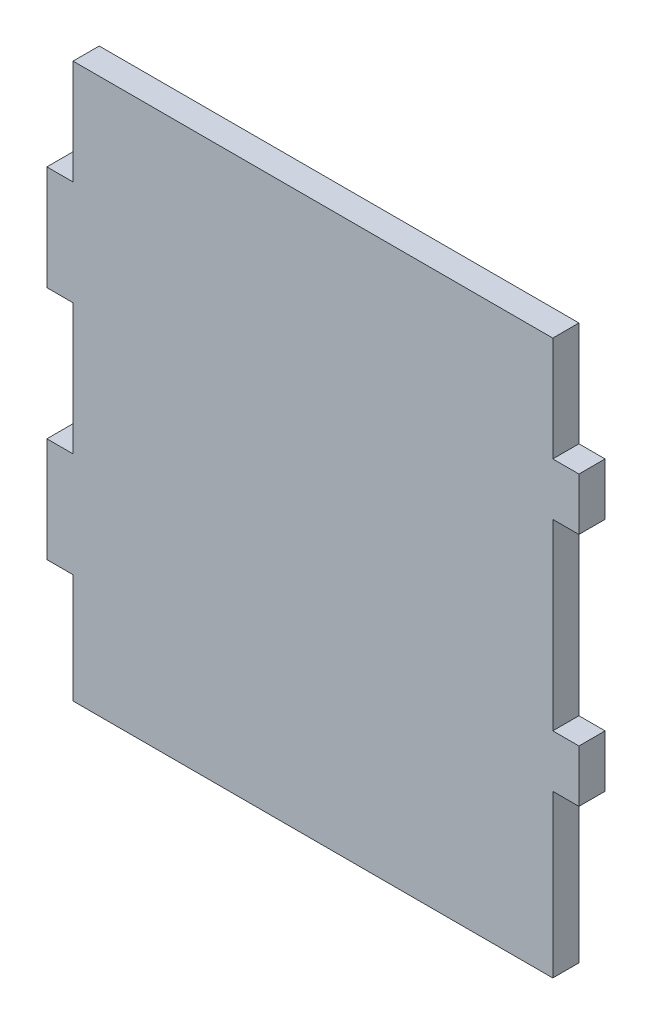
ISO-10303-21;
HEADER;
FILE_DESCRIPTION(('STEP AP214'),'2;1');
FILE_NAME('part.step','',(''),(''),'','','');
FILE_SCHEMA(('AUTOMOTIVE_DESIGN { 1 0 10303 214 1 1 1 1 }'));
ENDSEC;
DATA;
#1=APPLICATION_CONTEXT('core data for automotive mechanical design processes');
#2=APPLICATION_PROTOCOL_DEFINITION('international standard','automotive_design',2000,#1);
#3=PRODUCT_CONTEXT('',#1,'mechanical');
#4=PRODUCT('Part','Part','',(#3));
#5=PRODUCT_RELATED_PRODUCT_CATEGORY('part','',(#4));
#6=PRODUCT_DEFINITION_FORMATION('','',#4);
#7=PRODUCT_DEFINITION_CONTEXT('part definition',#1,'design');
#8=PRODUCT_DEFINITION('design','',#6,#7);
#9=PRODUCT_DEFINITION_SHAPE('','',#8);
#10=(LENGTH_UNIT() NAMED_UNIT(*) SI_UNIT(.MILLI.,.METRE.));
#11=(NAMED_UNIT(*) PLANE_ANGLE_UNIT() SI_UNIT($,.RADIAN.));
#12=(NAMED_UNIT(*) SI_UNIT($,.STERADIAN.) SOLID_ANGLE_UNIT());
#13=UNCERTAINTY_MEASURE_WITH_UNIT(LENGTH_MEASURE(1.E-05),#10,'distance_accuracy_value','');
#14=(GEOMETRIC_REPRESENTATION_CONTEXT(3) GLOBAL_UNCERTAINTY_ASSIGNED_CONTEXT((#13)) GLOBAL_UNIT_ASSIGNED_CONTEXT((#10,
#11,#12)) REPRESENTATION_CONTEXT('',''));
#15=CARTESIAN_POINT('',(0.,0.,0.));
#16=DIRECTION('',(0.,0.,1.));
#17=DIRECTION('',(1.,0.,0.));
#18=AXIS2_PLACEMENT_3D('',#15,#16,#17);
#19=CARTESIAN_POINT('',(0.,-12.,3.));
#20=DIRECTION('',(0.,-1.,0.));
#21=DIRECTION('',(0.,0.,-1.));
#22=AXIS2_PLACEMENT_3D('',#19,#20,#21);
#23=PLANE('',#22);
#24=DIRECTION('',(-1.,0.,0.));
#25=VECTOR('',#24,1.);
#26=CARTESIAN_POINT('',(0.,-12.,0.));
#27=LINE('',#26,#25);
#28=CARTESIAN_POINT('',(0.,-12.,0.));
#29=VERTEX_POINT('',#28);
#30=CARTESIAN_POINT('',(-3.,-12.,0.));
#31=VERTEX_POINT('',#30);
#32=EDGE_CURVE('E209',#29,#31,#27,.T.);
#33=ORIENTED_EDGE('',*,*,#32,.T.);
#34=DIRECTION('',(0.,0.,-1.));
#35=VECTOR('',#34,1.);
#36=CARTESIAN_POINT('',(-3.,-12.,3.));
#37=LINE('',#36,#35);
#38=CARTESIAN_POINT('',(-3.,-12.,3.));
#39=VERTEX_POINT('',#38);
#40=EDGE_CURVE('E11',#39,#31,#37,.T.);
#41=ORIENTED_EDGE('',*,*,#40,.F.);
#42=DIRECTION('',(-1.,0.,0.));
#43=VECTOR('',#42,1.);
#44=CARTESIAN_POINT('',(0.,-12.,3.));
#45=LINE('',#44,#43);
#46=CARTESIAN_POINT('',(0.,-12.,3.));
#47=VERTEX_POINT('',#46);
#48=EDGE_CURVE('E247',#47,#39,#45,.T.);
#49=ORIENTED_EDGE('',*,*,#48,.F.);
#50=DIRECTION('',(0.,0.,-1.));
#51=VECTOR('',#50,1.);
#52=CARTESIAN_POINT('',(0.,-12.,3.));
#53=LINE('',#52,#51);
#54=EDGE_CURVE('E205',#47,#29,#53,.T.);
#55=ORIENTED_EDGE('',*,*,#54,.T.);
#56=EDGE_LOOP('',(#33,#41,#49,#55));
#57=FACE_BOUND('',#56,.T.);
#58=ADVANCED_FACE('F41',(#57),#23,.F.);
#59=CARTESIAN_POINT('',(-3.,-12.,3.));
#60=DIRECTION('',(1.,0.,0.));
#61=DIRECTION('',(0.,1.,0.));
#62=AXIS2_PLACEMENT_3D('',#59,#60,#61);
#63=PLANE('',#62);
#64=DIRECTION('',(0.,-1.,0.));
#65=VECTOR('',#64,1.);
#66=CARTESIAN_POINT('',(-3.,-12.,0.));
#67=LINE('',#66,#65);
#68=CARTESIAN_POINT('',(-3.,-24.,0.));
#69=VERTEX_POINT('',#68);
#70=EDGE_CURVE('E212',#31,#69,#67,.T.);
#71=ORIENTED_EDGE('',*,*,#70,.T.);
#72=DIRECTION('',(0.,0.,-1.));
#73=VECTOR('',#72,1.);
#74=CARTESIAN_POINT('',(-3.,-24.,3.));
#75=LINE('',#74,#73);
#76=CARTESIAN_POINT('',(-3.,-24.,3.));
#77=VERTEX_POINT('',#76);
#78=EDGE_CURVE('E49',#77,#69,#75,.T.);
#79=ORIENTED_EDGE('',*,*,#78,.F.);
#80=DIRECTION('',(0.,-1.,0.));
#81=VECTOR('',#80,1.);
#82=CARTESIAN_POINT('',(-3.,-12.,3.));
#83=LINE('',#82,#81);
#84=EDGE_CURVE('E136',#39,#77,#83,.T.);
#85=ORIENTED_EDGE('',*,*,#84,.F.);
#86=ORIENTED_EDGE('',*,*,#40,.T.);
#87=EDGE_LOOP('',(#71,#79,#85,#86));
#88=FACE_BOUND('',#87,.T.);
#89=ADVANCED_FACE('F365',(#88),#63,.F.);
#90=CARTESIAN_POINT('',(0.,-24.,3.));
#91=DIRECTION('',(0.,1.,0.));
#92=DIRECTION('',(0.,0.,1.));
#93=AXIS2_PLACEMENT_3D('',#90,#91,#92);
#94=PLANE('',#93);
#95=DIRECTION('',(1.,0.,0.));
#96=VECTOR('',#95,1.);
#97=CARTESIAN_POINT('',(0.,-24.,0.));
#98=LINE('',#97,#96);
#99=CARTESIAN_POINT('',(0.,-24.,0.));
#100=VERTEX_POINT('',#99);
#101=EDGE_CURVE('E214',#69,#100,#98,.T.);
#102=ORIENTED_EDGE('',*,*,#101,.T.);
#103=DIRECTION('',(0.,0.,-1.));
#104=VECTOR('',#103,1.);
#105=CARTESIAN_POINT('',(0.,-24.,3.));
#106=LINE('',#105,#104);
#107=CARTESIAN_POINT('',(0.,-24.,3.));
#108=VERTEX_POINT('',#107);
#109=EDGE_CURVE('E290',#108,#100,#106,.T.);
#110=ORIENTED_EDGE('',*,*,#109,.F.);
#111=DIRECTION('',(1.,0.,0.));
#112=VECTOR('',#111,1.);
#113=CARTESIAN_POINT('',(0.,-24.,3.));
#114=LINE('',#113,#112);
#115=EDGE_CURVE('E298',#77,#108,#114,.T.);
#116=ORIENTED_EDGE('',*,*,#115,.F.);
#117=ORIENTED_EDGE('',*,*,#78,.T.);
#118=EDGE_LOOP('',(#102,#110,#116,#117));
#119=FACE_BOUND('',#118,.T.);
#120=ADVANCED_FACE('F296',(#119),#94,.F.);
#121=CARTESIAN_POINT('',(0.,-24.,3.));
#122=DIRECTION('',(1.,0.,0.));
#123=DIRECTION('',(0.,1.,0.));
#124=AXIS2_PLACEMENT_3D('',#121,#122,#123);
#125=PLANE('',#124);
#126=DIRECTION('',(0.,-1.,0.));
#127=VECTOR('',#126,1.);
#128=CARTESIAN_POINT('',(0.,-24.,0.));
#129=LINE('',#128,#127);
#130=CARTESIAN_POINT('',(0.,-39.,0.));
#131=VERTEX_POINT('',#130);
#132=EDGE_CURVE('E216',#100,#131,#129,.T.);
#133=ORIENTED_EDGE('',*,*,#132,.T.);
#134=DIRECTION('',(0.,0.,-1.));
#135=VECTOR('',#134,1.);
#136=CARTESIAN_POINT('',(0.,-39.,3.));
#137=LINE('',#136,#135);
#138=CARTESIAN_POINT('',(0.,-39.,3.));
#139=VERTEX_POINT('',#138);
#140=EDGE_CURVE('E287',#139,#131,#137,.T.);
#141=ORIENTED_EDGE('',*,*,#140,.F.);
#142=DIRECTION('',(0.,-1.,0.));
#143=VECTOR('',#142,1.);
#144=CARTESIAN_POINT('',(0.,-24.,3.));
#145=LINE('',#144,#143);
#146=EDGE_CURVE('E316',#108,#139,#145,.T.);
#147=ORIENTED_EDGE('',*,*,#146,.F.);
#148=ORIENTED_EDGE('',*,*,#109,.T.);
#149=EDGE_LOOP('',(#133,#141,#147,#148));
#150=FACE_BOUND('',#149,.T.);
#151=ADVANCED_FACE('F307',(#150),#125,.F.);
#152=CARTESIAN_POINT('',(0.,-39.,3.));
#153=DIRECTION('',(0.,-1.,0.));
#154=DIRECTION('',(0.,0.,-1.));
#155=AXIS2_PLACEMENT_3D('',#152,#153,#154);
#156=PLANE('',#155);
#157=DIRECTION('',(-1.,0.,0.));
#158=VECTOR('',#157,1.);
#159=CARTESIAN_POINT('',(0.,-39.,0.));
#160=LINE('',#159,#158);
#161=CARTESIAN_POINT('',(-3.,-39.,0.));
#162=VERTEX_POINT('',#161);
#163=EDGE_CURVE('E218',#131,#162,#160,.T.);
#164=ORIENTED_EDGE('',*,*,#163,.T.);
#165=DIRECTION('',(0.,0.,-1.));
#166=VECTOR('',#165,1.);
#167=CARTESIAN_POINT('',(-3.,-39.,3.));
#168=LINE('',#167,#166);
#169=CARTESIAN_POINT('',(-3.,-39.,3.));
#170=VERTEX_POINT('',#169);
#171=EDGE_CURVE('E284',#170,#162,#168,.T.);
#172=ORIENTED_EDGE('',*,*,#171,.F.);
#173=DIRECTION('',(-1.,0.,0.));
#174=VECTOR('',#173,1.);
#175=CARTESIAN_POINT('',(0.,-39.,3.));
#176=LINE('',#175,#174);
#177=EDGE_CURVE('E313',#139,#170,#176,.T.);
#178=ORIENTED_EDGE('',*,*,#177,.F.);
#179=ORIENTED_EDGE('',*,*,#140,.T.);
#180=EDGE_LOOP('',(#164,#172,#178,#179));
#181=FACE_BOUND('',#180,.T.);
#182=ADVANCED_FACE('F311',(#181),#156,.F.);
#183=CARTESIAN_POINT('',(-3.,-39.,3.));
#184=DIRECTION('',(1.,0.,0.));
#185=DIRECTION('',(0.,1.,0.));
#186=AXIS2_PLACEMENT_3D('',#183,#184,#185);
#187=PLANE('',#186);
#188=DIRECTION('',(0.,-1.,0.));
#189=VECTOR('',#188,1.);
#190=CARTESIAN_POINT('',(-3.,-39.,0.));
#191=LINE('',#190,#189);
#192=CARTESIAN_POINT('',(-3.,-51.,0.));
#193=VERTEX_POINT('',#192);
#194=EDGE_CURVE('E220',#162,#193,#191,.T.);
#195=ORIENTED_EDGE('',*,*,#194,.T.);
#196=DIRECTION('',(0.,0.,-1.));
#197=VECTOR('',#196,1.);
#198=CARTESIAN_POINT('',(-3.,-51.,3.));
#199=LINE('',#198,#197);
#200=CARTESIAN_POINT('',(-3.,-51.,3.));
#201=VERTEX_POINT('',#200);
#202=EDGE_CURVE('E281',#201,#193,#199,.T.);
#203=ORIENTED_EDGE('',*,*,#202,.F.);
#204=DIRECTION('',(0.,-1.,0.));
#205=VECTOR('',#204,1.);
#206=CARTESIAN_POINT('',(-3.,-39.,3.));
#207=LINE('',#206,#205);
#208=EDGE_CURVE('E315',#170,#201,#207,.T.);
#209=ORIENTED_EDGE('',*,*,#208,.F.);
#210=ORIENTED_EDGE('',*,*,#171,.T.);
#211=EDGE_LOOP('',(#195,#203,#209,#210));
#212=FACE_BOUND('',#211,.T.);
#213=ADVANCED_FACE('F378',(#212),#187,.F.);
#214=CARTESIAN_POINT('',(0.,-51.,3.));
#215=DIRECTION('',(0.,1.,0.));
#216=DIRECTION('',(0.,0.,1.));
#217=AXIS2_PLACEMENT_3D('',#214,#215,#216);
#218=PLANE('',#217);
#219=DIRECTION('',(1.,0.,0.));
#220=VECTOR('',#219,1.);
#221=CARTESIAN_POINT('',(0.,-51.,0.));
#222=LINE('',#221,#220);
#223=CARTESIAN_POINT('',(0.,-51.,0.));
#224=VERTEX_POINT('',#223);
#225=EDGE_CURVE('E222',#193,#224,#222,.T.);
#226=ORIENTED_EDGE('',*,*,#225,.T.);
#227=DIRECTION('',(0.,0.,-1.));
#228=VECTOR('',#227,1.);
#229=CARTESIAN_POINT('',(0.,-51.,3.));
#230=LINE('',#229,#228);
#231=CARTESIAN_POINT('',(0.,-51.,3.));
#232=VERTEX_POINT('',#231);
#233=EDGE_CURVE('E278',#232,#224,#230,.T.);
#234=ORIENTED_EDGE('',*,*,#233,.F.);
#235=DIRECTION('',(1.,0.,0.));
#236=VECTOR('',#235,1.);
#237=CARTESIAN_POINT('',(0.,-51.,3.));
#238=LINE('',#237,#236);
#239=EDGE_CURVE('E318',#201,#232,#238,.T.);
#240=ORIENTED_EDGE('',*,*,#239,.F.);
#241=ORIENTED_EDGE('',*,*,#202,.T.);
#242=EDGE_LOOP('',(#226,#234,#240,#241));
#243=FACE_BOUND('',#242,.T.);
#244=ADVANCED_FACE('F381',(#243),#218,.F.);
#245=CARTESIAN_POINT('',(0.,-51.,3.));
#246=DIRECTION('',(1.,0.,0.));
#247=DIRECTION('',(0.,1.,0.));
#248=AXIS2_PLACEMENT_3D('',#245,#246,#247);
#249=PLANE('',#248);
#250=DIRECTION('',(0.,-1.,0.));
#251=VECTOR('',#250,1.);
#252=CARTESIAN_POINT('',(0.,-51.,0.));
#253=LINE('',#252,#251);
#254=CARTESIAN_POINT('',(0.,-63.54,0.));
#255=VERTEX_POINT('',#254);
#256=EDGE_CURVE('E224',#224,#255,#253,.T.);
#257=ORIENTED_EDGE('',*,*,#256,.T.);
#258=DIRECTION('',(0.,0.,-1.));
#259=VECTOR('',#258,1.);
#260=CARTESIAN_POINT('',(0.,-63.54,3.));
#261=LINE('',#260,#259);
#262=CARTESIAN_POINT('',(0.,-63.54,3.));
#263=VERTEX_POINT('',#262);
#264=EDGE_CURVE('E275',#263,#255,#261,.T.);
#265=ORIENTED_EDGE('',*,*,#264,.F.);
#266=DIRECTION('',(0.,-1.,0.));
#267=VECTOR('',#266,1.);
#268=CARTESIAN_POINT('',(0.,-51.,3.));
#269=LINE('',#268,#267);
#270=EDGE_CURVE('E324',#232,#263,#269,.T.);
#271=ORIENTED_EDGE('',*,*,#270,.F.);
#272=ORIENTED_EDGE('',*,*,#233,.T.);
#273=EDGE_LOOP('',(#257,#265,#271,#272));
#274=FACE_BOUND('',#273,.T.);
#275=ADVANCED_FACE('F385',(#274),#249,.F.);
#276=CARTESIAN_POINT('',(0.,-63.54,3.));
#277=DIRECTION('',(0.,1.,0.));
#278=DIRECTION('',(0.,0.,1.));
#279=AXIS2_PLACEMENT_3D('',#276,#277,#278);
#280=PLANE('',#279);
#281=DIRECTION('',(1.,0.,0.));
#282=VECTOR('',#281,1.);
#283=CARTESIAN_POINT('',(0.,-63.54,0.));
#284=LINE('',#283,#282);
#285=CARTESIAN_POINT('',(55.,-63.54,0.));
#286=VERTEX_POINT('',#285);
#287=EDGE_CURVE('E226',#255,#286,#284,.T.);
#288=ORIENTED_EDGE('',*,*,#287,.T.);
#289=DIRECTION('',(0.,0.,-1.));
#290=VECTOR('',#289,1.);
#291=CARTESIAN_POINT('',(55.,-63.54,3.));
#292=LINE('',#291,#290);
#293=CARTESIAN_POINT('',(55.,-63.54,3.));
#294=VERTEX_POINT('',#293);
#295=EDGE_CURVE('E272',#294,#286,#292,.T.);
#296=ORIENTED_EDGE('',*,*,#295,.F.);
#297=DIRECTION('',(1.,0.,0.));
#298=VECTOR('',#297,1.);
#299=CARTESIAN_POINT('',(0.,-63.54,3.));
#300=LINE('',#299,#298);
#301=EDGE_CURVE('E326',#263,#294,#300,.T.);
#302=ORIENTED_EDGE('',*,*,#301,.F.);
#303=ORIENTED_EDGE('',*,*,#264,.T.);
#304=EDGE_LOOP('',(#288,#296,#302,#303));
#305=FACE_BOUND('',#304,.T.);
#306=ADVANCED_FACE('F389',(#305),#280,.F.);
#307=CARTESIAN_POINT('',(55.,-45.,3.));
#308=DIRECTION('',(-1.,0.,0.));
#309=DIRECTION('',(0.,0.,1.));
#310=AXIS2_PLACEMENT_3D('',#307,#308,#309);
#311=PLANE('',#310);
#312=DIRECTION('',(0.,1.,0.));
#313=VECTOR('',#312,1.);
#314=CARTESIAN_POINT('',(55.,-45.,0.));
#315=LINE('',#314,#313);
#316=CARTESIAN_POINT('',(55.,-45.,0.));
#317=VERTEX_POINT('',#316);
#318=EDGE_CURVE('E228',#286,#317,#315,.T.);
#319=ORIENTED_EDGE('',*,*,#318,.T.);
#320=DIRECTION('',(0.,0.,-1.));
#321=VECTOR('',#320,1.);
#322=CARTESIAN_POINT('',(55.,-45.,3.));
#323=LINE('',#322,#321);
#324=CARTESIAN_POINT('',(55.,-45.,3.));
#325=VERTEX_POINT('',#324);
#326=EDGE_CURVE('E269',#325,#317,#323,.T.);
#327=ORIENTED_EDGE('',*,*,#326,.F.);
#328=DIRECTION('',(0.,1.,0.));
#329=VECTOR('',#328,1.);
#330=CARTESIAN_POINT('',(55.,-45.,3.));
#331=LINE('',#330,#329);
#332=EDGE_CURVE('E328',#294,#325,#331,.T.);
#333=ORIENTED_EDGE('',*,*,#332,.F.);
#334=ORIENTED_EDGE('',*,*,#295,.T.);
#335=EDGE_LOOP('',(#319,#327,#333,#334));
#336=FACE_BOUND('',#335,.T.);
#337=ADVANCED_FACE('F393',(#336),#311,.F.);
#338=CARTESIAN_POINT('',(55.,-45.,3.));
#339=DIRECTION('',(0.,1.,0.));
#340=DIRECTION('',(0.,0.,1.));
#341=AXIS2_PLACEMENT_3D('',#338,#339,#340);
#342=PLANE('',#341);
#343=DIRECTION('',(1.,0.,0.));
#344=VECTOR('',#343,1.);
#345=CARTESIAN_POINT('',(55.,-45.,0.));
#346=LINE('',#345,#344);
#347=CARTESIAN_POINT('',(58.,-45.,0.));
#348=VERTEX_POINT('',#347);
#349=EDGE_CURVE('E230',#317,#348,#346,.T.);
#350=ORIENTED_EDGE('',*,*,#349,.T.);
#351=DIRECTION('',(0.,0.,-1.));
#352=VECTOR('',#351,1.);
#353=CARTESIAN_POINT('',(58.,-45.,3.));
#354=LINE('',#353,#352);
#355=CARTESIAN_POINT('',(58.,-45.,3.));
#356=VERTEX_POINT('',#355);
#357=EDGE_CURVE('E266',#356,#348,#354,.T.);
#358=ORIENTED_EDGE('',*,*,#357,.F.);
#359=DIRECTION('',(1.,0.,0.));
#360=VECTOR('',#359,1.);
#361=CARTESIAN_POINT('',(55.,-45.,3.));
#362=LINE('',#361,#360);
#363=EDGE_CURVE('E330',#325,#356,#362,.T.);
#364=ORIENTED_EDGE('',*,*,#363,.F.);
#365=ORIENTED_EDGE('',*,*,#326,.T.);
#366=EDGE_LOOP('',(#350,#358,#364,#365));
#367=FACE_BOUND('',#366,.T.);
#368=ADVANCED_FACE('F397',(#367),#342,.F.);
#369=CARTESIAN_POINT('',(58.,-39.,3.));
#370=DIRECTION('',(-1.,0.,0.));
#371=DIRECTION('',(0.,0.,1.));
#372=AXIS2_PLACEMENT_3D('',#369,#370,#371);
#373=PLANE('',#372);
#374=DIRECTION('',(0.,1.,0.));
#375=VECTOR('',#374,1.);
#376=CARTESIAN_POINT('',(58.,-39.,0.));
#377=LINE('',#376,#375);
#378=CARTESIAN_POINT('',(58.,-39.,0.));
#379=VERTEX_POINT('',#378);
#380=EDGE_CURVE('E232',#348,#379,#377,.T.);
#381=ORIENTED_EDGE('',*,*,#380,.T.);
#382=DIRECTION('',(0.,0.,-1.));
#383=VECTOR('',#382,1.);
#384=CARTESIAN_POINT('',(58.,-39.,3.));
#385=LINE('',#384,#383);
#386=CARTESIAN_POINT('',(58.,-39.,3.));
#387=VERTEX_POINT('',#386);
#388=EDGE_CURVE('E263',#387,#379,#385,.T.);
#389=ORIENTED_EDGE('',*,*,#388,.F.);
#390=DIRECTION('',(0.,1.,0.));
#391=VECTOR('',#390,1.);
#392=CARTESIAN_POINT('',(58.,-39.,3.));
#393=LINE('',#392,#391);
#394=EDGE_CURVE('E332',#356,#387,#393,.T.);
#395=ORIENTED_EDGE('',*,*,#394,.F.);
#396=ORIENTED_EDGE('',*,*,#357,.T.);
#397=EDGE_LOOP('',(#381,#389,#395,#396));
#398=FACE_BOUND('',#397,.T.);
#399=ADVANCED_FACE('F401',(#398),#373,.F.);
#400=CARTESIAN_POINT('',(55.,-39.,3.));
#401=DIRECTION('',(0.,-1.,0.));
#402=DIRECTION('',(0.,0.,-1.));
#403=AXIS2_PLACEMENT_3D('',#400,#401,#402);
#404=PLANE('',#403);
#405=DIRECTION('',(-1.,0.,0.));
#406=VECTOR('',#405,1.);
#407=CARTESIAN_POINT('',(55.,-39.,0.));
#408=LINE('',#407,#406);
#409=CARTESIAN_POINT('',(55.,-39.,0.));
#410=VERTEX_POINT('',#409);
#411=EDGE_CURVE('E234',#379,#410,#408,.T.);
#412=ORIENTED_EDGE('',*,*,#411,.T.);
#413=DIRECTION('',(0.,0.,-1.));
#414=VECTOR('',#413,1.);
#415=CARTESIAN_POINT('',(55.,-39.,3.));
#416=LINE('',#415,#414);
#417=CARTESIAN_POINT('',(55.,-39.,3.));
#418=VERTEX_POINT('',#417);
#419=EDGE_CURVE('E260',#418,#410,#416,.T.);
#420=ORIENTED_EDGE('',*,*,#419,.F.);
#421=DIRECTION('',(-1.,0.,0.));
#422=VECTOR('',#421,1.);
#423=CARTESIAN_POINT('',(55.,-39.,3.));
#424=LINE('',#423,#422);
#425=EDGE_CURVE('E334',#387,#418,#424,.T.);
#426=ORIENTED_EDGE('',*,*,#425,.F.);
#427=ORIENTED_EDGE('',*,*,#388,.T.);
#428=EDGE_LOOP('',(#412,#420,#426,#427));
#429=FACE_BOUND('',#428,.T.);
#430=ADVANCED_FACE('F405',(#429),#404,.F.);
#431=CARTESIAN_POINT('',(55.,-18.,3.));
#432=DIRECTION('',(-1.,0.,0.));
#433=DIRECTION('',(0.,0.,1.));
#434=AXIS2_PLACEMENT_3D('',#431,#432,#433);
#435=PLANE('',#434);
#436=DIRECTION('',(0.,1.,0.));
#437=VECTOR('',#436,1.);
#438=CARTESIAN_POINT('',(55.,-18.,0.));
#439=LINE('',#438,#437);
#440=CARTESIAN_POINT('',(55.,-18.,0.));
#441=VERTEX_POINT('',#440);
#442=EDGE_CURVE('E236',#410,#441,#439,.T.);
#443=ORIENTED_EDGE('',*,*,#442,.T.);
#444=DIRECTION('',(0.,0.,-1.));
#445=VECTOR('',#444,1.);
#446=CARTESIAN_POINT('',(55.,-18.,3.));
#447=LINE('',#446,#445);
#448=CARTESIAN_POINT('',(55.,-18.,3.));
#449=VERTEX_POINT('',#448);
#450=EDGE_CURVE('E257',#449,#441,#447,.T.);
#451=ORIENTED_EDGE('',*,*,#450,.F.);
#452=DIRECTION('',(0.,1.,0.));
#453=VECTOR('',#452,1.);
#454=CARTESIAN_POINT('',(55.,-18.,3.));
#455=LINE('',#454,#453);
#456=EDGE_CURVE('E336',#418,#449,#455,.T.);
#457=ORIENTED_EDGE('',*,*,#456,.F.);
#458=ORIENTED_EDGE('',*,*,#419,.T.);
#459=EDGE_LOOP('',(#443,#451,#457,#458));
#460=FACE_BOUND('',#459,.T.);
#461=ADVANCED_FACE('F409',(#460),#435,.F.);
#462=CARTESIAN_POINT('',(55.,-18.,3.));
#463=DIRECTION('',(0.,1.,0.));
#464=DIRECTION('',(0.,0.,1.));
#465=AXIS2_PLACEMENT_3D('',#462,#463,#464);
#466=PLANE('',#465);
#467=DIRECTION('',(1.,0.,0.));
#468=VECTOR('',#467,1.);
#469=CARTESIAN_POINT('',(55.,-18.,0.));
#470=LINE('',#469,#468);
#471=CARTESIAN_POINT('',(58.,-18.,0.));
#472=VERTEX_POINT('',#471);
#473=EDGE_CURVE('E238',#441,#472,#470,.T.);
#474=ORIENTED_EDGE('',*,*,#473,.T.);
#475=DIRECTION('',(0.,0.,-1.));
#476=VECTOR('',#475,1.);
#477=CARTESIAN_POINT('',(58.,-18.,3.));
#478=LINE('',#477,#476);
#479=CARTESIAN_POINT('',(58.,-18.,3.));
#480=VERTEX_POINT('',#479);
#481=EDGE_CURVE('E254',#480,#472,#478,.T.);
#482=ORIENTED_EDGE('',*,*,#481,.F.);
#483=DIRECTION('',(1.,0.,0.));
#484=VECTOR('',#483,1.);
#485=CARTESIAN_POINT('',(55.,-18.,3.));
#486=LINE('',#485,#484);
#487=EDGE_CURVE('E338',#449,#480,#486,.T.);
#488=ORIENTED_EDGE('',*,*,#487,.F.);
#489=ORIENTED_EDGE('',*,*,#450,.T.);
#490=EDGE_LOOP('',(#474,#482,#488,#489));
#491=FACE_BOUND('',#490,.T.);
#492=ADVANCED_FACE('F413',(#491),#466,.F.);
#493=CARTESIAN_POINT('',(58.,-12.,3.));
#494=DIRECTION('',(-1.,0.,0.));
#495=DIRECTION('',(0.,0.,1.));
#496=AXIS2_PLACEMENT_3D('',#493,#494,#495);
#497=PLANE('',#496);
#498=DIRECTION('',(0.,1.,0.));
#499=VECTOR('',#498,1.);
#500=CARTESIAN_POINT('',(58.,-12.,0.));
#501=LINE('',#500,#499);
#502=CARTESIAN_POINT('',(58.,-12.,0.));
#503=VERTEX_POINT('',#502);
#504=EDGE_CURVE('E240',#472,#503,#501,.T.);
#505=ORIENTED_EDGE('',*,*,#504,.T.);
#506=DIRECTION('',(0.,0.,-1.));
#507=VECTOR('',#506,1.);
#508=CARTESIAN_POINT('',(58.,-12.,3.));
#509=LINE('',#508,#507);
#510=CARTESIAN_POINT('',(58.,-12.,3.));
#511=VERTEX_POINT('',#510);
#512=EDGE_CURVE('E251',#511,#503,#509,.T.);
#513=ORIENTED_EDGE('',*,*,#512,.F.);
#514=DIRECTION('',(0.,1.,0.));
#515=VECTOR('',#514,1.);
#516=CARTESIAN_POINT('',(58.,-12.,3.));
#517=LINE('',#516,#515);
#518=EDGE_CURVE('E340',#480,#511,#517,.T.);
#519=ORIENTED_EDGE('',*,*,#518,.F.);
#520=ORIENTED_EDGE('',*,*,#481,.T.);
#521=EDGE_LOOP('',(#505,#513,#519,#520));
#522=FACE_BOUND('',#521,.T.);
#523=ADVANCED_FACE('F346',(#522),#497,.F.);
#524=CARTESIAN_POINT('',(55.,-12.,3.));
#525=DIRECTION('',(0.,-1.,0.));
#526=DIRECTION('',(0.,0.,-1.));
#527=AXIS2_PLACEMENT_3D('',#524,#525,#526);
#528=PLANE('',#527);
#529=DIRECTION('',(-1.,0.,0.));
#530=VECTOR('',#529,1.);
#531=CARTESIAN_POINT('',(55.,-12.,0.));
#532=LINE('',#531,#530);
#533=CARTESIAN_POINT('',(55.,-12.,0.));
#534=VERTEX_POINT('',#533);
#535=EDGE_CURVE('E242',#503,#534,#532,.T.);
#536=ORIENTED_EDGE('',*,*,#535,.T.);
#537=DIRECTION('',(0.,0.,-1.));
#538=VECTOR('',#537,1.);
#539=CARTESIAN_POINT('',(55.,-12.,3.));
#540=LINE('',#539,#538);
#541=CARTESIAN_POINT('',(55.,-12.,3.));
#542=VERTEX_POINT('',#541);
#543=EDGE_CURVE('E200',#542,#534,#540,.T.);
#544=ORIENTED_EDGE('',*,*,#543,.F.);
#545=DIRECTION('',(-1.,0.,0.));
#546=VECTOR('',#545,1.);
#547=CARTESIAN_POINT('',(55.,-12.,3.));
#548=LINE('',#547,#546);
#549=EDGE_CURVE('E191',#511,#542,#548,.T.);
#550=ORIENTED_EDGE('',*,*,#549,.F.);
#551=ORIENTED_EDGE('',*,*,#512,.T.);
#552=EDGE_LOOP('',(#536,#544,#550,#551));
#553=FACE_BOUND('',#552,.T.);
#554=ADVANCED_FACE('F350',(#553),#528,.F.);
#555=CARTESIAN_POINT('',(55.,0.,3.));
#556=DIRECTION('',(-1.,0.,0.));
#557=DIRECTION('',(0.,0.,1.));
#558=AXIS2_PLACEMENT_3D('',#555,#556,#557);
#559=PLANE('',#558);
#560=DIRECTION('',(0.,1.,0.));
#561=VECTOR('',#560,1.);
#562=CARTESIAN_POINT('',(55.,0.,0.));
#563=LINE('',#562,#561);
#564=CARTESIAN_POINT('',(55.,0.,0.));
#565=VERTEX_POINT('',#564);
#566=EDGE_CURVE('E199',#534,#565,#563,.T.);
#567=ORIENTED_EDGE('',*,*,#566,.T.);
#568=DIRECTION('',(0.,0.,-1.));
#569=VECTOR('',#568,1.);
#570=CARTESIAN_POINT('',(55.,0.,3.));
#571=LINE('',#570,#569);
#572=CARTESIAN_POINT('',(55.,0.,3.));
#573=VERTEX_POINT('',#572);
#574=EDGE_CURVE('E196',#573,#565,#571,.T.);
#575=ORIENTED_EDGE('',*,*,#574,.F.);
#576=DIRECTION('',(0.,1.,0.));
#577=VECTOR('',#576,1.);
#578=CARTESIAN_POINT('',(55.,0.,3.));
#579=LINE('',#578,#577);
#580=EDGE_CURVE('E185',#542,#573,#579,.T.);
#581=ORIENTED_EDGE('',*,*,#580,.F.);
#582=ORIENTED_EDGE('',*,*,#543,.T.);
#583=EDGE_LOOP('',(#567,#575,#581,#582));
#584=FACE_BOUND('',#583,.T.);
#585=ADVANCED_FACE('F197',(#584),#559,.F.);
#586=CARTESIAN_POINT('',(0.,0.,3.));
#587=DIRECTION('',(0.,-1.,0.));
#588=DIRECTION('',(0.,0.,-1.));
#589=AXIS2_PLACEMENT_3D('',#586,#587,#588);
#590=PLANE('',#589);
#591=DIRECTION('',(-1.,0.,0.));
#592=VECTOR('',#591,1.);
#593=CARTESIAN_POINT('',(0.,0.,0.));
#594=LINE('',#593,#592);
#595=CARTESIAN_POINT('',(0.,0.,0.));
#596=VERTEX_POINT('',#595);
#597=EDGE_CURVE('E122',#565,#596,#594,.T.);
#598=ORIENTED_EDGE('',*,*,#597,.T.);
#599=DIRECTION('',(0.,0.,-1.));
#600=VECTOR('',#599,1.);
#601=CARTESIAN_POINT('',(0.,0.,3.));
#602=LINE('',#601,#600);
#603=CARTESIAN_POINT('',(0.,0.,3.));
#604=VERTEX_POINT('',#603);
#605=EDGE_CURVE('E201',#604,#596,#602,.T.);
#606=ORIENTED_EDGE('',*,*,#605,.F.);
#607=DIRECTION('',(-1.,0.,0.));
#608=VECTOR('',#607,1.);
#609=CARTESIAN_POINT('',(0.,0.,3.));
#610=LINE('',#609,#608);
#611=EDGE_CURVE('E189',#573,#604,#610,.T.);
#612=ORIENTED_EDGE('',*,*,#611,.F.);
#613=ORIENTED_EDGE('',*,*,#574,.T.);
#614=EDGE_LOOP('',(#598,#606,#612,#613));
#615=FACE_BOUND('',#614,.T.);
#616=ADVANCED_FACE('F203',(#615),#590,.F.);
#617=CARTESIAN_POINT('',(0.,0.,3.));
#618=DIRECTION('',(1.,0.,0.));
#619=DIRECTION('',(0.,1.,0.));
#620=AXIS2_PLACEMENT_3D('',#617,#618,#619);
#621=PLANE('',#620);
#622=DIRECTION('',(0.,-1.,0.));
#623=VECTOR('',#622,1.);
#624=CARTESIAN_POINT('',(0.,0.,0.));
#625=LINE('',#624,#623);
#626=EDGE_CURVE('E128',#596,#29,#625,.T.);
#627=ORIENTED_EDGE('',*,*,#626,.T.);
#628=ORIENTED_EDGE('',*,*,#54,.F.);
#629=DIRECTION('',(0.,-1.,0.));
#630=VECTOR('',#629,1.);
#631=CARTESIAN_POINT('',(0.,0.,3.));
#632=LINE('',#631,#630);
#633=EDGE_CURVE('E57',#604,#47,#632,.T.);
#634=ORIENTED_EDGE('',*,*,#633,.F.);
#635=ORIENTED_EDGE('',*,*,#605,.T.);
#636=EDGE_LOOP('',(#627,#628,#634,#635));
#637=FACE_BOUND('',#636,.T.);
#638=ADVANCED_FACE('F354',(#637),#621,.F.);
#639=CARTESIAN_POINT('',(0.,0.,3.));
#640=DIRECTION('',(0.,0.,1.));
#641=DIRECTION('',(1.,0.,0.));
#642=AXIS2_PLACEMENT_3D('',#639,#640,#641);
#643=PLANE('',#642);
#644=ORIENTED_EDGE('',*,*,#48,.T.);
#645=ORIENTED_EDGE('',*,*,#84,.T.);
#646=ORIENTED_EDGE('',*,*,#115,.T.);
#647=ORIENTED_EDGE('',*,*,#146,.T.);
#648=ORIENTED_EDGE('',*,*,#177,.T.);
#649=ORIENTED_EDGE('',*,*,#208,.T.);
#650=ORIENTED_EDGE('',*,*,#239,.T.);
#651=ORIENTED_EDGE('',*,*,#270,.T.);
#652=ORIENTED_EDGE('',*,*,#301,.T.);
#653=ORIENTED_EDGE('',*,*,#332,.T.);
#654=ORIENTED_EDGE('',*,*,#363,.T.);
#655=ORIENTED_EDGE('',*,*,#394,.T.);
#656=ORIENTED_EDGE('',*,*,#425,.T.);
#657=ORIENTED_EDGE('',*,*,#456,.T.);
#658=ORIENTED_EDGE('',*,*,#487,.T.);
#659=ORIENTED_EDGE('',*,*,#518,.T.);
#660=ORIENTED_EDGE('',*,*,#549,.T.);
#661=ORIENTED_EDGE('',*,*,#580,.T.);
#662=ORIENTED_EDGE('',*,*,#611,.T.);
#663=ORIENTED_EDGE('',*,*,#633,.T.);
#664=EDGE_LOOP('',(#644,#645,#646,#647,#648,#649,#650,#651,#652,#653,#654,#655,#656,#657,#658,
#659,#660,#661,#662,#663));
#665=FACE_BOUND('',#664,.T.);
#666=ADVANCED_FACE('F187',(#665),#643,.T.);
#667=CARTESIAN_POINT('',(0.,0.,0.));
#668=DIRECTION('',(0.,0.,1.));
#669=DIRECTION('',(1.,0.,0.));
#670=AXIS2_PLACEMENT_3D('',#667,#668,#669);
#671=PLANE('',#670);
#672=ORIENTED_EDGE('',*,*,#32,.F.);
#673=ORIENTED_EDGE('',*,*,#626,.F.);
#674=ORIENTED_EDGE('',*,*,#597,.F.);
#675=ORIENTED_EDGE('',*,*,#566,.F.);
#676=ORIENTED_EDGE('',*,*,#535,.F.);
#677=ORIENTED_EDGE('',*,*,#504,.F.);
#678=ORIENTED_EDGE('',*,*,#473,.F.);
#679=ORIENTED_EDGE('',*,*,#442,.F.);
#680=ORIENTED_EDGE('',*,*,#411,.F.);
#681=ORIENTED_EDGE('',*,*,#380,.F.);
#682=ORIENTED_EDGE('',*,*,#349,.F.);
#683=ORIENTED_EDGE('',*,*,#318,.F.);
#684=ORIENTED_EDGE('',*,*,#287,.F.);
#685=ORIENTED_EDGE('',*,*,#256,.F.);
#686=ORIENTED_EDGE('',*,*,#225,.F.);
#687=ORIENTED_EDGE('',*,*,#194,.F.);
#688=ORIENTED_EDGE('',*,*,#163,.F.);
#689=ORIENTED_EDGE('',*,*,#132,.F.);
#690=ORIENTED_EDGE('',*,*,#101,.F.);
#691=ORIENTED_EDGE('',*,*,#70,.F.);
#692=EDGE_LOOP('',(#672,#673,#674,#675,#676,#677,#678,#679,#680,#681,#682,#683,#684,#685,#686,
#687,#688,#689,#690,#691));
#693=FACE_BOUND('',#692,.T.);
#694=ADVANCED_FACE('F302',(#693),#671,.F.);
#695=CLOSED_SHELL('',(#58,#89,#120,#151,#182,#213,#244,#275,#306,#337,#368,#399,#430,#461,#492,
#523,#554,#585,#616,#638,#666,#694));
#696=MANIFOLD_SOLID_BREP('B2',#695);
#697=ADVANCED_BREP_SHAPE_REPRESENTATION('',(#18,#696),#14);
#698=SHAPE_DEFINITION_REPRESENTATION(#9,#697);
ENDSEC;
END-ISO-10303-21;
